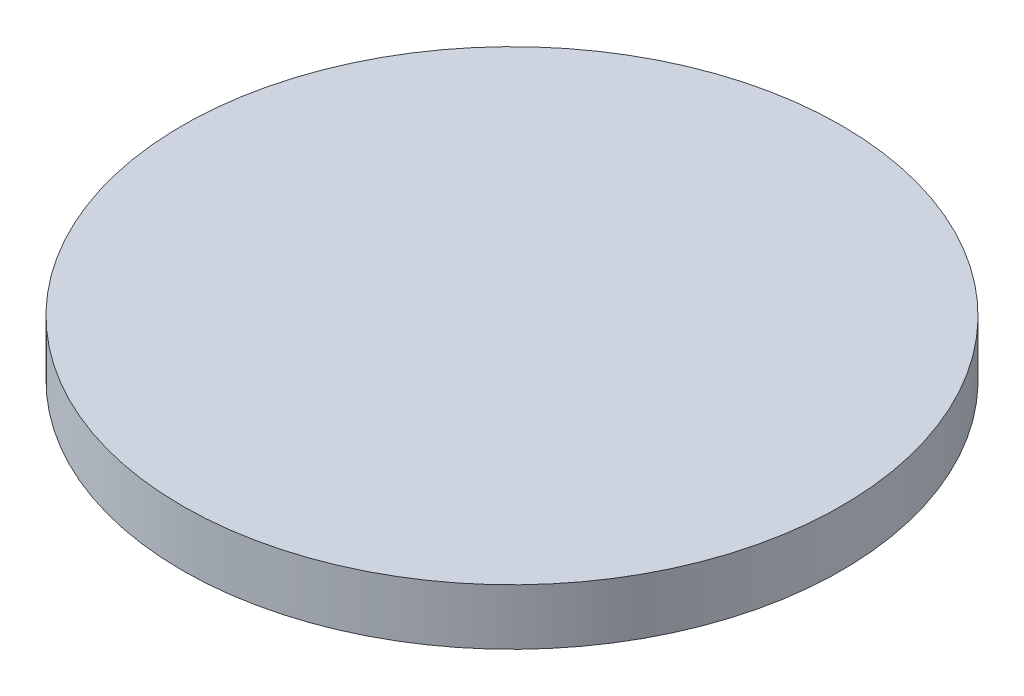
ISO-10303-21;
HEADER;
FILE_DESCRIPTION(('STEP AP214'),'2;1');
FILE_NAME('part.step','',(''),(''),'','','');
FILE_SCHEMA(('AUTOMOTIVE_DESIGN { 1 0 10303 214 1 1 1 1 }'));
ENDSEC;
DATA;
#1=APPLICATION_CONTEXT('core data for automotive mechanical design processes');
#2=APPLICATION_PROTOCOL_DEFINITION('international standard','automotive_design',2000,#1);
#3=PRODUCT_CONTEXT('',#1,'mechanical');
#4=PRODUCT('Part','Part','',(#3));
#5=PRODUCT_RELATED_PRODUCT_CATEGORY('part','',(#4));
#6=PRODUCT_DEFINITION_FORMATION('','',#4);
#7=PRODUCT_DEFINITION_CONTEXT('part definition',#1,'design');
#8=PRODUCT_DEFINITION('design','',#6,#7);
#9=PRODUCT_DEFINITION_SHAPE('','',#8);
#10=(LENGTH_UNIT() NAMED_UNIT(*) SI_UNIT(.MILLI.,.METRE.));
#11=(NAMED_UNIT(*) PLANE_ANGLE_UNIT() SI_UNIT($,.RADIAN.));
#12=(NAMED_UNIT(*) SI_UNIT($,.STERADIAN.) SOLID_ANGLE_UNIT());
#13=UNCERTAINTY_MEASURE_WITH_UNIT(LENGTH_MEASURE(1.E-05),#10,'distance_accuracy_value','');
#14=(GEOMETRIC_REPRESENTATION_CONTEXT(3) GLOBAL_UNCERTAINTY_ASSIGNED_CONTEXT((#13)) GLOBAL_UNIT_ASSIGNED_CONTEXT((#10,
#11,#12)) REPRESENTATION_CONTEXT('',''));
#15=CARTESIAN_POINT('',(0.,0.,0.));
#16=DIRECTION('',(0.,0.,1.));
#17=DIRECTION('',(1.,0.,0.));
#18=AXIS2_PLACEMENT_3D('',#15,#16,#17);
#19=CARTESIAN_POINT('',(0.,2.84,0.));
#20=DIRECTION('',(0.,-1.,0.));
#21=DIRECTION('',(0.,0.,-1.));
#22=AXIS2_PLACEMENT_3D('',#19,#20,#21);
#23=CYLINDRICAL_SURFACE('',#22,16.75);
#24=CARTESIAN_POINT('',(0.,2.84,0.));
#25=DIRECTION('',(0.,1.,0.));
#26=DIRECTION('',(0.,0.,1.));
#27=AXIS2_PLACEMENT_3D('',#24,#25,#26);
#28=CIRCLE('',#27,16.75);
#29=CARTESIAN_POINT('',(0.,2.84,-16.75));
#30=VERTEX_POINT('',#29);
#31=EDGE_CURVE('E10',#30,#30,#28,.T.);
#32=CARTESIAN_POINT('',(0.,0.,0.));
#33=DIRECTION('',(0.,1.,0.));
#34=DIRECTION('',(0.,0.,1.));
#35=AXIS2_PLACEMENT_3D('',#32,#33,#34);
#36=CIRCLE('',#35,16.75);
#37=CARTESIAN_POINT('',(0.,0.,-16.75));
#38=VERTEX_POINT('',#37);
#39=EDGE_CURVE('E42',#38,#38,#36,.T.);
#40=CARTESIAN_POINT('',(0.,2.84,-16.75));
#41=CARTESIAN_POINT('',(0.,2.81041666666667,-16.75));
#42=CARTESIAN_POINT('',(0.,2.78083333333333,-16.75));
#43=CARTESIAN_POINT('',(0.,2.72166666666667,-16.75));
#44=CARTESIAN_POINT('',(0.,2.69208333333333,-16.75));
#45=CARTESIAN_POINT('',(0.,2.63291666666667,-16.75));
#46=CARTESIAN_POINT('',(0.,2.60333333333333,-16.75));
#47=CARTESIAN_POINT('',(0.,2.54416666666667,-16.75));
#48=CARTESIAN_POINT('',(0.,2.51458333333333,-16.75));
#49=CARTESIAN_POINT('',(0.,2.45541666666667,-16.75));
#50=CARTESIAN_POINT('',(0.,2.42583333333333,-16.75));
#51=CARTESIAN_POINT('',(0.,2.36666666666667,-16.75));
#52=CARTESIAN_POINT('',(0.,2.33708333333333,-16.75));
#53=CARTESIAN_POINT('',(0.,2.27791666666667,-16.75));
#54=CARTESIAN_POINT('',(0.,2.24833333333333,-16.75));
#55=CARTESIAN_POINT('',(0.,2.18916666666667,-16.75));
#56=CARTESIAN_POINT('',(0.,2.15958333333333,-16.75));
#57=CARTESIAN_POINT('',(0.,2.10041666666667,-16.75));
#58=CARTESIAN_POINT('',(0.,2.07083333333333,-16.75));
#59=CARTESIAN_POINT('',(0.,2.01166666666667,-16.75));
#60=CARTESIAN_POINT('',(0.,1.98208333333333,-16.75));
#61=CARTESIAN_POINT('',(0.,1.92291666666667,-16.75));
#62=CARTESIAN_POINT('',(0.,1.89333333333333,-16.75));
#63=CARTESIAN_POINT('',(0.,1.83416666666667,-16.75));
#64=CARTESIAN_POINT('',(0.,1.80458333333333,-16.75));
#65=CARTESIAN_POINT('',(0.,1.74541666666667,-16.75));
#66=CARTESIAN_POINT('',(0.,1.71583333333333,-16.75));
#67=CARTESIAN_POINT('',(0.,1.65666666666667,-16.75));
#68=CARTESIAN_POINT('',(0.,1.62708333333333,-16.75));
#69=CARTESIAN_POINT('',(0.,1.56791666666667,-16.75));
#70=CARTESIAN_POINT('',(0.,1.53833333333333,-16.75));
#71=CARTESIAN_POINT('',(0.,1.47916666666667,-16.75));
#72=CARTESIAN_POINT('',(0.,1.44958333333333,-16.75));
#73=CARTESIAN_POINT('',(0.,1.39041666666667,-16.75));
#74=CARTESIAN_POINT('',(0.,1.36083333333333,-16.75));
#75=CARTESIAN_POINT('',(0.,1.30166666666667,-16.75));
#76=CARTESIAN_POINT('',(0.,1.27208333333333,-16.75));
#77=CARTESIAN_POINT('',(0.,1.21291666666667,-16.75));
#78=CARTESIAN_POINT('',(0.,1.18333333333333,-16.75));
#79=CARTESIAN_POINT('',(0.,1.12416666666667,-16.75));
#80=CARTESIAN_POINT('',(0.,1.09458333333333,-16.75));
#81=CARTESIAN_POINT('',(0.,1.03541666666667,-16.75));
#82=CARTESIAN_POINT('',(0.,1.00583333333333,-16.75));
#83=CARTESIAN_POINT('',(0.,0.946666666666666,-16.75));
#84=CARTESIAN_POINT('',(0.,0.917083333333333,-16.75));
#85=CARTESIAN_POINT('',(0.,0.857916666666666,-16.75));
#86=CARTESIAN_POINT('',(0.,0.828333333333333,-16.75));
#87=CARTESIAN_POINT('',(0.,0.769166666666666,-16.75));
#88=CARTESIAN_POINT('',(0.,0.739583333333333,-16.75));
#89=CARTESIAN_POINT('',(0.,0.680416666666666,-16.75));
#90=CARTESIAN_POINT('',(0.,0.650833333333333,-16.75));
#91=CARTESIAN_POINT('',(0.,0.591666666666666,-16.75));
#92=CARTESIAN_POINT('',(0.,0.562083333333333,-16.75));
#93=CARTESIAN_POINT('',(0.,0.502916666666666,-16.75));
#94=CARTESIAN_POINT('',(0.,0.473333333333333,-16.75));
#95=CARTESIAN_POINT('',(0.,0.414166666666666,-16.75));
#96=CARTESIAN_POINT('',(0.,0.384583333333333,-16.75));
#97=CARTESIAN_POINT('',(0.,0.325416666666666,-16.75));
#98=CARTESIAN_POINT('',(0.,0.295833333333333,-16.75));
#99=CARTESIAN_POINT('',(0.,0.236666666666666,-16.75));
#100=CARTESIAN_POINT('',(0.,0.207083333333333,-16.75));
#101=CARTESIAN_POINT('',(0.,0.147916666666666,-16.75));
#102=CARTESIAN_POINT('',(0.,0.118333333333333,-16.75));
#103=CARTESIAN_POINT('',(0.,0.0591666666666661,-16.75));
#104=CARTESIAN_POINT('',(0.,0.0295833333333329,-16.75));
#105=CARTESIAN_POINT('',(0.,0.,-16.75));
#106=B_SPLINE_CURVE_WITH_KNOTS('',3,(#40,#41,#42,#43,#44,#45,#46,#47,#48,#49,#50,#51,#52,#53,
#54,#55,#56,#57,#58,#59,#60,#61,#62,#63,#64,#65,#66,#67,#68,#69,#70,#71,#72,#73,#74,#75,#76,#77,
#78,#79,#80,#81,#82,#83,#84,#85,#86,#87,#88,#89,#90,#91,#92,#93,#94,#95,#96,#97,#98,#99,#100,
#101,#102,#103,#104,#105),.UNSPECIFIED.,.F.,.F.,(4,2,2,2,2,2,2,2,2,2,2,2,2,2,2,2,2,2,2,2,2,2,2,
2,2,2,2,2,2,2,2,2,4),(0.,0.0887500000000003,0.1775,0.26625,0.355,0.44375,0.5325,0.62125,0.71,
0.79875,0.8875,0.97625,1.065,1.15375,1.2425,1.33125,1.42,1.50875,1.5975,1.68625,1.775,1.86375,
1.9525,2.04125,2.13,2.21875,2.3075,2.39625,2.485,2.57375,2.6625,2.75125,2.84),.UNSPECIFIED.);
#107=EDGE_CURVE('BSEAM39',#30,#38,#106,.T.);
#108=ORIENTED_EDGE('',*,*,#31,.F.);
#109=ORIENTED_EDGE('',*,*,#39,.T.);
#110=ORIENTED_EDGE('',*,*,#107,.T.);
#111=ORIENTED_EDGE('',*,*,#107,.F.);
#112=EDGE_LOOP('',(#108,#110,#109,#111));
#113=FACE_BOUND('',#112,.T.);
#114=ADVANCED_FACE('F39',(#113),#23,.T.);
#115=CARTESIAN_POINT('',(0.,2.84,0.));
#116=DIRECTION('',(0.,1.,0.));
#117=DIRECTION('',(0.,0.,1.));
#118=AXIS2_PLACEMENT_3D('',#115,#116,#117);
#119=PLANE('',#118);
#120=ORIENTED_EDGE('',*,*,#31,.T.);
#121=EDGE_LOOP('',(#120));
#122=FACE_BOUND('',#121,.T.);
#123=ADVANCED_FACE('F56',(#122),#119,.T.);
#124=CARTESIAN_POINT('',(0.,0.,0.));
#125=DIRECTION('',(0.,1.,0.));
#126=DIRECTION('',(0.,0.,1.));
#127=AXIS2_PLACEMENT_3D('',#124,#125,#126);
#128=PLANE('',#127);
#129=ORIENTED_EDGE('',*,*,#39,.F.);
#130=EDGE_LOOP('',(#129));
#131=FACE_BOUND('',#130,.T.);
#132=ADVANCED_FACE('F54',(#131),#128,.F.);
#133=CLOSED_SHELL('',(#114,#123,#132));
#134=MANIFOLD_SOLID_BREP('B2',#133);
#135=ADVANCED_BREP_SHAPE_REPRESENTATION('',(#18,#134),#14);
#136=SHAPE_DEFINITION_REPRESENTATION(#9,#135);
ENDSEC;
END-ISO-10303-21;
